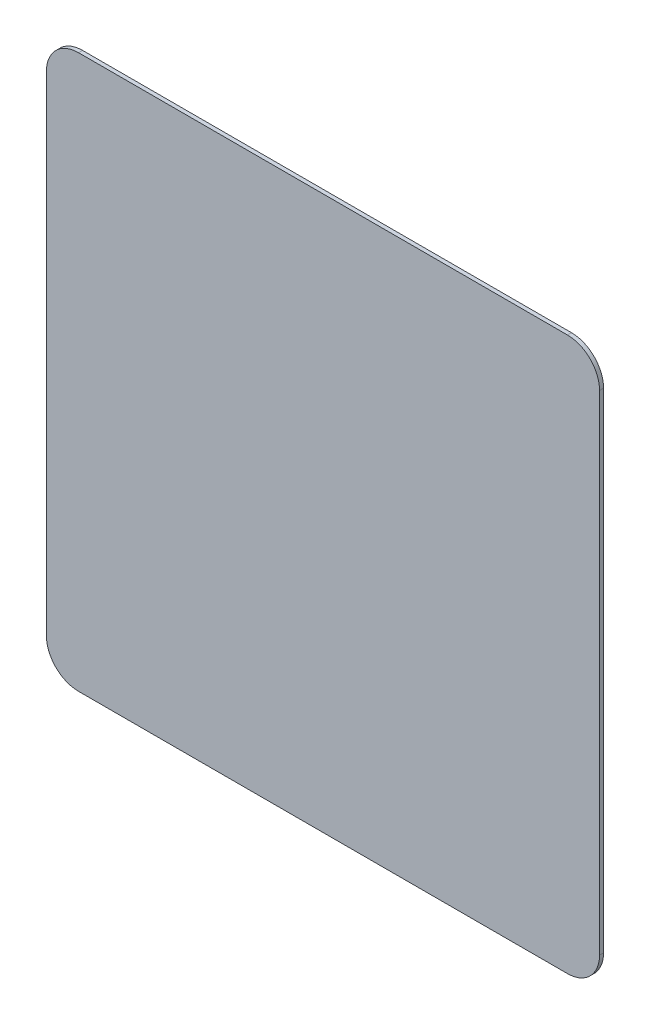
ISO-10303-21;
HEADER;
FILE_DESCRIPTION(('STEP AP214'),'2;1');
FILE_NAME('part.step','',(''),(''),'','','');
FILE_SCHEMA(('AUTOMOTIVE_DESIGN { 1 0 10303 214 1 1 1 1 }'));
ENDSEC;
DATA;
#1=APPLICATION_CONTEXT('core data for automotive mechanical design processes');
#2=APPLICATION_PROTOCOL_DEFINITION('international standard','automotive_design',2000,#1);
#3=PRODUCT_CONTEXT('',#1,'mechanical');
#4=PRODUCT('Part','Part','',(#3));
#5=PRODUCT_RELATED_PRODUCT_CATEGORY('part','',(#4));
#6=PRODUCT_DEFINITION_FORMATION('','',#4);
#7=PRODUCT_DEFINITION_CONTEXT('part definition',#1,'design');
#8=PRODUCT_DEFINITION('design','',#6,#7);
#9=PRODUCT_DEFINITION_SHAPE('','',#8);
#10=(LENGTH_UNIT() NAMED_UNIT(*) SI_UNIT(.MILLI.,.METRE.));
#11=(NAMED_UNIT(*) PLANE_ANGLE_UNIT() SI_UNIT($,.RADIAN.));
#12=(NAMED_UNIT(*) SI_UNIT($,.STERADIAN.) SOLID_ANGLE_UNIT());
#13=UNCERTAINTY_MEASURE_WITH_UNIT(LENGTH_MEASURE(1.E-05),#10,'distance_accuracy_value','');
#14=(GEOMETRIC_REPRESENTATION_CONTEXT(3) GLOBAL_UNCERTAINTY_ASSIGNED_CONTEXT((#13)) GLOBAL_UNIT_ASSIGNED_CONTEXT((#10,
#11,#12)) REPRESENTATION_CONTEXT('',''));
#15=CARTESIAN_POINT('',(0.,0.,0.));
#16=DIRECTION('',(0.,0.,1.));
#17=DIRECTION('',(1.,0.,0.));
#18=AXIS2_PLACEMENT_3D('',#15,#16,#17);
#19=CARTESIAN_POINT('',(0.,0.,1.5875));
#20=DIRECTION('',(1.,0.,0.));
#21=DIRECTION('',(0.,1.,0.));
#22=AXIS2_PLACEMENT_3D('',#19,#20,#21);
#23=PLANE('',#22);
#24=DIRECTION('',(0.,-1.,0.));
#25=VECTOR('',#24,1.);
#26=CARTESIAN_POINT('',(0.,0.,0.));
#27=LINE('',#26,#25);
#28=CARTESIAN_POINT('',(0.,-12.7,0.));
#29=VERTEX_POINT('',#28);
#30=CARTESIAN_POINT('',(0.,-206.375,0.));
#31=VERTEX_POINT('',#30);
#32=EDGE_CURVE('E130',#29,#31,#27,.T.);
#33=ORIENTED_EDGE('',*,*,#32,.T.);
#34=DIRECTION('',(0.,0.,-1.));
#35=VECTOR('',#34,1.);
#36=CARTESIAN_POINT('',(0.,-206.375,1.5875));
#37=LINE('',#36,#35);
#38=CARTESIAN_POINT('',(0.,-206.375,1.5875));
#39=VERTEX_POINT('',#38);
#40=EDGE_CURVE('E54',#31,#39,#37,.F.);
#41=ORIENTED_EDGE('',*,*,#40,.T.);
#42=DIRECTION('',(0.,-1.,0.));
#43=VECTOR('',#42,1.);
#44=CARTESIAN_POINT('',(0.,0.,1.5875));
#45=LINE('',#44,#43);
#46=CARTESIAN_POINT('',(0.,-12.7,1.5875));
#47=VERTEX_POINT('',#46);
#48=EDGE_CURVE('E128',#47,#39,#45,.T.);
#49=ORIENTED_EDGE('',*,*,#48,.F.);
#50=DIRECTION('',(0.,0.,-1.));
#51=VECTOR('',#50,1.);
#52=CARTESIAN_POINT('',(0.,-12.7,1.5875));
#53=LINE('',#52,#51);
#54=EDGE_CURVE('E152',#47,#29,#53,.T.);
#55=ORIENTED_EDGE('',*,*,#54,.T.);
#56=EDGE_LOOP('',(#33,#41,#49,#55));
#57=FACE_BOUND('',#56,.T.);
#58=ADVANCED_FACE('F33',(#57),#23,.F.);
#59=CARTESIAN_POINT('',(0.,-219.075,1.5875));
#60=DIRECTION('',(0.,1.,0.));
#61=DIRECTION('',(0.,0.,1.));
#62=AXIS2_PLACEMENT_3D('',#59,#60,#61);
#63=PLANE('',#62);
#64=DIRECTION('',(1.,0.,0.));
#65=VECTOR('',#64,1.);
#66=CARTESIAN_POINT('',(0.,-219.075,1.5875));
#67=LINE('',#66,#65);
#68=CARTESIAN_POINT('',(12.7000000000001,-219.075,1.5875));
#69=VERTEX_POINT('',#68);
#70=CARTESIAN_POINT('',(206.375,-219.075,1.5875));
#71=VERTEX_POINT('',#70);
#72=EDGE_CURVE('E161',#69,#71,#67,.T.);
#73=ORIENTED_EDGE('',*,*,#72,.F.);
#74=DIRECTION('',(0.,0.,-1.));
#75=VECTOR('',#74,1.);
#76=CARTESIAN_POINT('',(12.7000000000001,-219.075,1.5875));
#77=LINE('',#76,#75);
#78=CARTESIAN_POINT('',(12.7000000000001,-219.075,0.));
#79=VERTEX_POINT('',#78);
#80=EDGE_CURVE('E145',#69,#79,#77,.T.);
#81=ORIENTED_EDGE('',*,*,#80,.T.);
#82=DIRECTION('',(1.,0.,0.));
#83=VECTOR('',#82,1.);
#84=CARTESIAN_POINT('',(0.,-219.075,0.));
#85=LINE('',#84,#83);
#86=CARTESIAN_POINT('',(206.375,-219.075,0.));
#87=VERTEX_POINT('',#86);
#88=EDGE_CURVE('E126',#79,#87,#85,.T.);
#89=ORIENTED_EDGE('',*,*,#88,.T.);
#90=DIRECTION('',(0.,0.,-1.));
#91=VECTOR('',#90,1.);
#92=CARTESIAN_POINT('',(206.375,-219.075,1.5875));
#93=LINE('',#92,#91);
#94=EDGE_CURVE('E107',#87,#71,#93,.F.);
#95=ORIENTED_EDGE('',*,*,#94,.T.);
#96=EDGE_LOOP('',(#73,#81,#89,#95));
#97=FACE_BOUND('',#96,.T.);
#98=ADVANCED_FACE('F165',(#97),#63,.F.);
#99=CARTESIAN_POINT('',(219.075,0.,1.5875));
#100=DIRECTION('',(-1.,0.,0.));
#101=DIRECTION('',(0.,-1.,0.));
#102=AXIS2_PLACEMENT_3D('',#99,#100,#101);
#103=PLANE('',#102);
#104=DIRECTION('',(0.,1.,0.));
#105=VECTOR('',#104,1.);
#106=CARTESIAN_POINT('',(219.075,0.,1.5875));
#107=LINE('',#106,#105);
#108=CARTESIAN_POINT('',(219.075,-206.375,1.5875));
#109=VERTEX_POINT('',#108);
#110=CARTESIAN_POINT('',(219.075,-12.7,1.5875));
#111=VERTEX_POINT('',#110);
#112=EDGE_CURVE('E120',#109,#111,#107,.T.);
#113=ORIENTED_EDGE('',*,*,#112,.F.);
#114=DIRECTION('',(0.,0.,-1.));
#115=VECTOR('',#114,1.);
#116=CARTESIAN_POINT('',(219.075,-206.375,1.5875));
#117=LINE('',#116,#115);
#118=CARTESIAN_POINT('',(219.075,-206.375,0.));
#119=VERTEX_POINT('',#118);
#120=EDGE_CURVE('E105',#109,#119,#117,.T.);
#121=ORIENTED_EDGE('',*,*,#120,.T.);
#122=DIRECTION('',(0.,1.,0.));
#123=VECTOR('',#122,1.);
#124=CARTESIAN_POINT('',(219.075,0.,0.));
#125=LINE('',#124,#123);
#126=CARTESIAN_POINT('',(219.075,-12.7,0.));
#127=VERTEX_POINT('',#126);
#128=EDGE_CURVE('E117',#119,#127,#125,.T.);
#129=ORIENTED_EDGE('',*,*,#128,.T.);
#130=DIRECTION('',(0.,0.,-1.));
#131=VECTOR('',#130,1.);
#132=CARTESIAN_POINT('',(219.075,-12.7,1.5875));
#133=LINE('',#132,#131);
#134=EDGE_CURVE('E121',#127,#111,#133,.F.);
#135=ORIENTED_EDGE('',*,*,#134,.T.);
#136=EDGE_LOOP('',(#113,#121,#129,#135));
#137=FACE_BOUND('',#136,.T.);
#138=ADVANCED_FACE('F116',(#137),#103,.F.);
#139=CARTESIAN_POINT('',(0.,0.,1.5875));
#140=DIRECTION('',(0.,-1.,0.));
#141=DIRECTION('',(0.,0.,-1.));
#142=AXIS2_PLACEMENT_3D('',#139,#140,#141);
#143=PLANE('',#142);
#144=DIRECTION('',(-1.,0.,0.));
#145=VECTOR('',#144,1.);
#146=CARTESIAN_POINT('',(0.,0.,0.));
#147=LINE('',#146,#145);
#148=CARTESIAN_POINT('',(206.375,0.,0.));
#149=VERTEX_POINT('',#148);
#150=CARTESIAN_POINT('',(12.7,0.,0.));
#151=VERTEX_POINT('',#150);
#152=EDGE_CURVE('E125',#149,#151,#147,.T.);
#153=ORIENTED_EDGE('',*,*,#152,.T.);
#154=DIRECTION('',(0.,0.,-1.));
#155=VECTOR('',#154,1.);
#156=CARTESIAN_POINT('',(12.7,0.,1.5875));
#157=LINE('',#156,#155);
#158=CARTESIAN_POINT('',(12.7,0.,1.5875));
#159=VERTEX_POINT('',#158);
#160=EDGE_CURVE('E11',#151,#159,#157,.F.);
#161=ORIENTED_EDGE('',*,*,#160,.T.);
#162=DIRECTION('',(-1.,0.,0.));
#163=VECTOR('',#162,1.);
#164=CARTESIAN_POINT('',(0.,0.,1.5875));
#165=LINE('',#164,#163);
#166=CARTESIAN_POINT('',(206.375,0.,1.5875));
#167=VERTEX_POINT('',#166);
#168=EDGE_CURVE('E134',#167,#159,#165,.T.);
#169=ORIENTED_EDGE('',*,*,#168,.F.);
#170=DIRECTION('',(0.,0.,-1.));
#171=VECTOR('',#170,1.);
#172=CARTESIAN_POINT('',(206.375,0.,1.5875));
#173=LINE('',#172,#171);
#174=EDGE_CURVE('E142',#167,#149,#173,.T.);
#175=ORIENTED_EDGE('',*,*,#174,.T.);
#176=EDGE_LOOP('',(#153,#161,#169,#175));
#177=FACE_BOUND('',#176,.T.);
#178=ADVANCED_FACE('F177',(#177),#143,.F.);
#179=CARTESIAN_POINT('',(0.,0.,1.5875));
#180=DIRECTION('',(0.,0.,1.));
#181=DIRECTION('',(1.,0.,0.));
#182=AXIS2_PLACEMENT_3D('',#179,#180,#181);
#183=PLANE('',#182);
#184=ORIENTED_EDGE('',*,*,#48,.T.);
#185=CARTESIAN_POINT('',(12.7000000000001,-206.375,1.5875));
#186=DIRECTION('',(0.,0.,1.));
#187=DIRECTION('',(1.,0.,0.));
#188=AXIS2_PLACEMENT_3D('',#185,#186,#187);
#189=CIRCLE('',#188,12.7);
#190=EDGE_CURVE('E41',#39,#69,#189,.T.);
#191=ORIENTED_EDGE('',*,*,#190,.T.);
#192=ORIENTED_EDGE('',*,*,#72,.T.);
#193=CARTESIAN_POINT('',(206.375,-206.375,1.5875));
#194=DIRECTION('',(0.,0.,1.));
#195=DIRECTION('',(1.,0.,0.));
#196=AXIS2_PLACEMENT_3D('',#193,#194,#195);
#197=CIRCLE('',#196,12.7);
#198=EDGE_CURVE('E140',#71,#109,#197,.T.);
#199=ORIENTED_EDGE('',*,*,#198,.T.);
#200=ORIENTED_EDGE('',*,*,#112,.T.);
#201=CARTESIAN_POINT('',(206.375,-12.7,1.5875));
#202=DIRECTION('',(0.,0.,1.));
#203=DIRECTION('',(1.,0.,0.));
#204=AXIS2_PLACEMENT_3D('',#201,#202,#203);
#205=CIRCLE('',#204,12.7);
#206=EDGE_CURVE('E138',#111,#167,#205,.T.);
#207=ORIENTED_EDGE('',*,*,#206,.T.);
#208=ORIENTED_EDGE('',*,*,#168,.T.);
#209=CARTESIAN_POINT('',(12.7,-12.7,1.5875));
#210=DIRECTION('',(0.,0.,1.));
#211=DIRECTION('',(1.,0.,0.));
#212=AXIS2_PLACEMENT_3D('',#209,#210,#211);
#213=CIRCLE('',#212,12.7);
#214=EDGE_CURVE('E156',#159,#47,#213,.T.);
#215=ORIENTED_EDGE('',*,*,#214,.T.);
#216=EDGE_LOOP('',(#184,#191,#192,#199,#200,#207,#208,#215));
#217=FACE_BOUND('',#216,.T.);
#218=ADVANCED_FACE('F160',(#217),#183,.T.);
#219=CARTESIAN_POINT('',(0.,0.,0.));
#220=DIRECTION('',(0.,0.,1.));
#221=DIRECTION('',(1.,0.,0.));
#222=AXIS2_PLACEMENT_3D('',#219,#220,#221);
#223=PLANE('',#222);
#224=ORIENTED_EDGE('',*,*,#88,.F.);
#225=CARTESIAN_POINT('',(12.7000000000001,-206.375,0.));
#226=DIRECTION('',(0.,0.,1.));
#227=DIRECTION('',(1.,0.,0.));
#228=AXIS2_PLACEMENT_3D('',#225,#226,#227);
#229=CIRCLE('',#228,12.7);
#230=EDGE_CURVE('E150',#79,#31,#229,.F.);
#231=ORIENTED_EDGE('',*,*,#230,.T.);
#232=ORIENTED_EDGE('',*,*,#32,.F.);
#233=CARTESIAN_POINT('',(12.7,-12.7,0.));
#234=DIRECTION('',(0.,0.,1.));
#235=DIRECTION('',(1.,0.,0.));
#236=AXIS2_PLACEMENT_3D('',#233,#234,#235);
#237=CIRCLE('',#236,12.7);
#238=EDGE_CURVE('E148',#29,#151,#237,.F.);
#239=ORIENTED_EDGE('',*,*,#238,.T.);
#240=ORIENTED_EDGE('',*,*,#152,.F.);
#241=CARTESIAN_POINT('',(206.375,-12.7,0.));
#242=DIRECTION('',(0.,0.,1.));
#243=DIRECTION('',(1.,0.,0.));
#244=AXIS2_PLACEMENT_3D('',#241,#242,#243);
#245=CIRCLE('',#244,12.7);
#246=EDGE_CURVE('E111',#149,#127,#245,.F.);
#247=ORIENTED_EDGE('',*,*,#246,.T.);
#248=ORIENTED_EDGE('',*,*,#128,.F.);
#249=CARTESIAN_POINT('',(206.375,-206.375,0.));
#250=DIRECTION('',(0.,0.,1.));
#251=DIRECTION('',(1.,0.,0.));
#252=AXIS2_PLACEMENT_3D('',#249,#250,#251);
#253=CIRCLE('',#252,12.7);
#254=EDGE_CURVE('E101',#119,#87,#253,.F.);
#255=ORIENTED_EDGE('',*,*,#254,.T.);
#256=EDGE_LOOP('',(#224,#231,#232,#239,#240,#247,#248,#255));
#257=FACE_BOUND('',#256,.T.);
#258=ADVANCED_FACE('F123',(#257),#223,.F.);
#259=CARTESIAN_POINT('',(206.375,-206.375,1.5875));
#260=DIRECTION('',(0.,0.,-1.));
#261=DIRECTION('',(-1.,0.,0.));
#262=AXIS2_PLACEMENT_3D('',#259,#260,#261);
#263=CYLINDRICAL_SURFACE('',#262,12.7);
#264=ORIENTED_EDGE('',*,*,#198,.F.);
#265=ORIENTED_EDGE('',*,*,#94,.F.);
#266=ORIENTED_EDGE('',*,*,#254,.F.);
#267=ORIENTED_EDGE('',*,*,#120,.F.);
#268=EDGE_LOOP('',(#264,#265,#266,#267));
#269=FACE_BOUND('',#268,.T.);
#270=ADVANCED_FACE('F104',(#269),#263,.T.);
#271=CARTESIAN_POINT('',(206.375,-12.7,1.5875));
#272=DIRECTION('',(0.,0.,-1.));
#273=DIRECTION('',(-1.,0.,0.));
#274=AXIS2_PLACEMENT_3D('',#271,#272,#273);
#275=CYLINDRICAL_SURFACE('',#274,12.7);
#276=ORIENTED_EDGE('',*,*,#206,.F.);
#277=ORIENTED_EDGE('',*,*,#134,.F.);
#278=ORIENTED_EDGE('',*,*,#246,.F.);
#279=ORIENTED_EDGE('',*,*,#174,.F.);
#280=EDGE_LOOP('',(#276,#277,#278,#279));
#281=FACE_BOUND('',#280,.T.);
#282=ADVANCED_FACE('F176',(#281),#275,.T.);
#283=CARTESIAN_POINT('',(12.7000000000001,-206.375,1.5875));
#284=DIRECTION('',(0.,0.,-1.));
#285=DIRECTION('',(-1.,0.,0.));
#286=AXIS2_PLACEMENT_3D('',#283,#284,#285);
#287=CYLINDRICAL_SURFACE('',#286,12.7);
#288=ORIENTED_EDGE('',*,*,#190,.F.);
#289=ORIENTED_EDGE('',*,*,#40,.F.);
#290=ORIENTED_EDGE('',*,*,#230,.F.);
#291=ORIENTED_EDGE('',*,*,#80,.F.);
#292=EDGE_LOOP('',(#288,#289,#290,#291));
#293=FACE_BOUND('',#292,.T.);
#294=ADVANCED_FACE('F167',(#293),#287,.T.);
#295=CARTESIAN_POINT('',(12.7,-12.7,1.5875));
#296=DIRECTION('',(0.,0.,-1.));
#297=DIRECTION('',(-1.,0.,0.));
#298=AXIS2_PLACEMENT_3D('',#295,#296,#297);
#299=CYLINDRICAL_SURFACE('',#298,12.7);
#300=ORIENTED_EDGE('',*,*,#214,.F.);
#301=ORIENTED_EDGE('',*,*,#160,.F.);
#302=ORIENTED_EDGE('',*,*,#238,.F.);
#303=ORIENTED_EDGE('',*,*,#54,.F.);
#304=EDGE_LOOP('',(#300,#301,#302,#303));
#305=FACE_BOUND('',#304,.T.);
#306=ADVANCED_FACE('F35',(#305),#299,.T.);
#307=CLOSED_SHELL('',(#58,#98,#138,#178,#218,#258,#270,#282,#294,#306));
#308=MANIFOLD_SOLID_BREP('B2',#307);
#309=ADVANCED_BREP_SHAPE_REPRESENTATION('',(#18,#308),#14);
#310=SHAPE_DEFINITION_REPRESENTATION(#9,#309);
ENDSEC;
END-ISO-10303-21;
